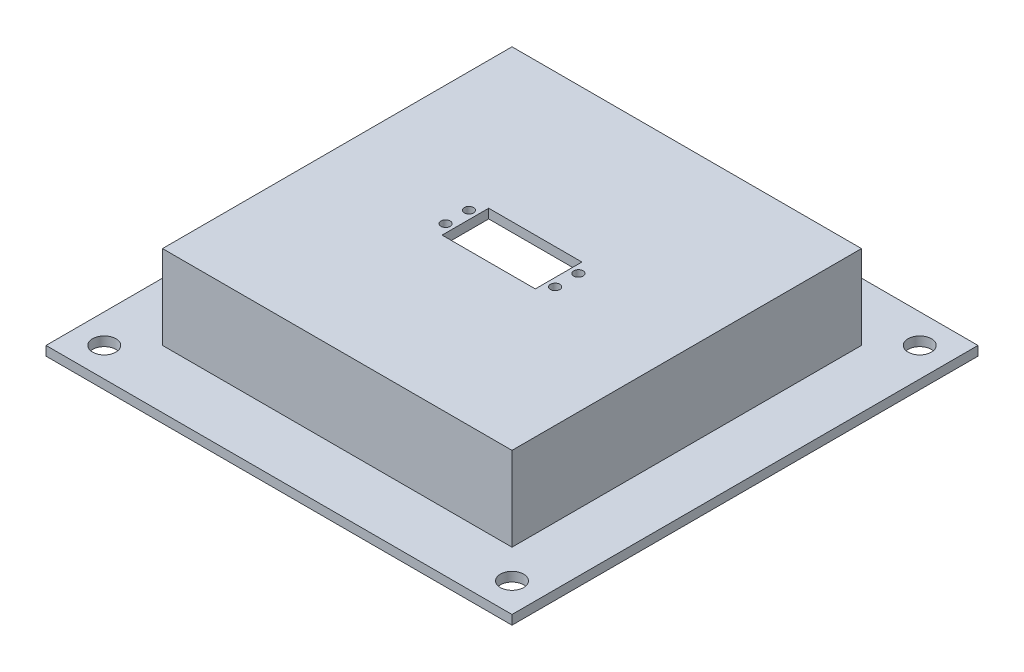
ISO-10303-21;
HEADER;
FILE_DESCRIPTION(('STEP AP214'),'2;1');
FILE_NAME('part.step','',(''),(''),'','','');
FILE_SCHEMA(('AUTOMOTIVE_DESIGN { 1 0 10303 214 1 1 1 1 }'));
ENDSEC;
DATA;
#1=APPLICATION_CONTEXT('core data for automotive mechanical design processes');
#2=APPLICATION_PROTOCOL_DEFINITION('international standard','automotive_design',2000,#1);
#3=PRODUCT_CONTEXT('',#1,'mechanical');
#4=PRODUCT('Part','Part','',(#3));
#5=PRODUCT_RELATED_PRODUCT_CATEGORY('part','',(#4));
#6=PRODUCT_DEFINITION_FORMATION('','',#4);
#7=PRODUCT_DEFINITION_CONTEXT('part definition',#1,'design');
#8=PRODUCT_DEFINITION('design','',#6,#7);
#9=PRODUCT_DEFINITION_SHAPE('','',#8);
#10=(LENGTH_UNIT() NAMED_UNIT(*) SI_UNIT(.MILLI.,.METRE.));
#11=(NAMED_UNIT(*) PLANE_ANGLE_UNIT() SI_UNIT($,.RADIAN.));
#12=(NAMED_UNIT(*) SI_UNIT($,.STERADIAN.) SOLID_ANGLE_UNIT());
#13=UNCERTAINTY_MEASURE_WITH_UNIT(LENGTH_MEASURE(1.E-05),#10,'distance_accuracy_value','');
#14=(GEOMETRIC_REPRESENTATION_CONTEXT(3) GLOBAL_UNCERTAINTY_ASSIGNED_CONTEXT((#13)) GLOBAL_UNIT_ASSIGNED_CONTEXT((#10,
#11,#12)) REPRESENTATION_CONTEXT('',''));
#15=CARTESIAN_POINT('',(0.,0.,0.));
#16=DIRECTION('',(0.,0.,1.));
#17=DIRECTION('',(1.,0.,0.));
#18=AXIS2_PLACEMENT_3D('',#15,#16,#17);
#19=CARTESIAN_POINT('',(0.,0.,0.));
#20=DIRECTION('',(0.,1.,0.));
#21=DIRECTION('',(0.,0.,1.));
#22=AXIS2_PLACEMENT_3D('',#19,#20,#21);
#23=PLANE('',#22);
#24=CARTESIAN_POINT('',(12.4999999999999,0.,12.5));
#25=DIRECTION('',(0.,1.,0.));
#26=DIRECTION('',(0.,0.,1.));
#27=AXIS2_PLACEMENT_3D('',#24,#25,#26);
#28=CIRCLE('',#27,5.00000000000001);
#29=CARTESIAN_POINT('',(12.4999999999999,0.,17.5));
#30=VERTEX_POINT('',#29);
#31=EDGE_CURVE('E186',#30,#30,#28,.F.);
#32=ORIENTED_EDGE('',*,*,#31,.F.);
#33=EDGE_LOOP('',(#32));
#34=FACE_BOUND('',#33,.T.);
#35=CARTESIAN_POINT('',(-162.5,0.,12.4999999999999));
#36=DIRECTION('',(0.,1.,0.));
#37=DIRECTION('',(0.,0.,1.));
#38=AXIS2_PLACEMENT_3D('',#35,#36,#37);
#39=CIRCLE('',#38,5.00000000000005);
#40=CARTESIAN_POINT('',(-162.5,0.,17.5));
#41=VERTEX_POINT('',#40);
#42=EDGE_CURVE('E187',#41,#41,#39,.F.);
#43=ORIENTED_EDGE('',*,*,#42,.F.);
#44=EDGE_LOOP('',(#43));
#45=FACE_BOUND('',#44,.T.);
#46=CARTESIAN_POINT('',(-162.5,0.,-162.5));
#47=DIRECTION('',(0.,1.,0.));
#48=DIRECTION('',(0.,0.,1.));
#49=AXIS2_PLACEMENT_3D('',#46,#47,#48);
#50=CIRCLE('',#49,5.00000000000003);
#51=CARTESIAN_POINT('',(-162.5,0.,-157.5));
#52=VERTEX_POINT('',#51);
#53=EDGE_CURVE('E194',#52,#52,#50,.F.);
#54=ORIENTED_EDGE('',*,*,#53,.F.);
#55=EDGE_LOOP('',(#54));
#56=FACE_BOUND('',#55,.T.);
#57=CARTESIAN_POINT('',(12.5,0.,-162.5));
#58=DIRECTION('',(0.,1.,0.));
#59=DIRECTION('',(0.,0.,1.));
#60=AXIS2_PLACEMENT_3D('',#57,#58,#59);
#61=CIRCLE('',#60,5.);
#62=CARTESIAN_POINT('',(12.5,0.,-157.5));
#63=VERTEX_POINT('',#62);
#64=EDGE_CURVE('E203',#63,#63,#61,.F.);
#65=ORIENTED_EDGE('',*,*,#64,.F.);
#66=EDGE_LOOP('',(#65));
#67=FACE_BOUND('',#66,.T.);
#68=DIRECTION('',(1.,0.,0.));
#69=VECTOR('',#68,1.);
#70=CARTESIAN_POINT('',(0.,0.,-4.));
#71=LINE('',#70,#69);
#72=CARTESIAN_POINT('',(-146.,0.,-3.99999999999998));
#73=VERTEX_POINT('',#72);
#74=CARTESIAN_POINT('',(-4.,0.,-4.));
#75=VERTEX_POINT('',#74);
#76=EDGE_CURVE('E260',#73,#75,#71,.T.);
#77=ORIENTED_EDGE('',*,*,#76,.T.);
#78=DIRECTION('',(0.,0.,-1.));
#79=VECTOR('',#78,1.);
#80=CARTESIAN_POINT('',(-4.,0.,0.));
#81=LINE('',#80,#79);
#82=CARTESIAN_POINT('',(-4.,0.,-146.));
#83=VERTEX_POINT('',#82);
#84=EDGE_CURVE('E245',#75,#83,#81,.T.);
#85=ORIENTED_EDGE('',*,*,#84,.T.);
#86=DIRECTION('',(-1.,0.,0.));
#87=VECTOR('',#86,1.);
#88=CARTESIAN_POINT('',(0.,0.,-146.));
#89=LINE('',#88,#87);
#90=CARTESIAN_POINT('',(-146.,0.,-146.));
#91=VERTEX_POINT('',#90);
#92=EDGE_CURVE('E274',#83,#91,#89,.T.);
#93=ORIENTED_EDGE('',*,*,#92,.T.);
#94=DIRECTION('',(0.,0.,1.));
#95=VECTOR('',#94,1.);
#96=CARTESIAN_POINT('',(-146.,0.,0.));
#97=LINE('',#96,#95);
#98=EDGE_CURVE('E277',#91,#73,#97,.T.);
#99=ORIENTED_EDGE('',*,*,#98,.T.);
#100=EDGE_LOOP('',(#77,#85,#93,#99));
#101=FACE_BOUND('',#100,.T.);
#102=DIRECTION('',(0.,0.,1.));
#103=VECTOR('',#102,1.);
#104=CARTESIAN_POINT('',(25.0000000000001,0.,-175.));
#105=LINE('',#104,#103);
#106=CARTESIAN_POINT('',(25.0000000000001,0.,-175.));
#107=VERTEX_POINT('',#106);
#108=CARTESIAN_POINT('',(25.0000000000001,0.,25.));
#109=VERTEX_POINT('',#108);
#110=EDGE_CURVE('E218',#107,#109,#105,.T.);
#111=ORIENTED_EDGE('',*,*,#110,.T.);
#112=DIRECTION('',(-1.,0.,0.));
#113=VECTOR('',#112,1.);
#114=CARTESIAN_POINT('',(25.0000000000001,0.,25.));
#115=LINE('',#114,#113);
#116=CARTESIAN_POINT('',(-175.,0.,25.));
#117=VERTEX_POINT('',#116);
#118=EDGE_CURVE('E235',#109,#117,#115,.T.);
#119=ORIENTED_EDGE('',*,*,#118,.T.);
#120=DIRECTION('',(0.,0.,-1.));
#121=VECTOR('',#120,1.);
#122=CARTESIAN_POINT('',(-175.,0.,-175.));
#123=LINE('',#122,#121);
#124=CARTESIAN_POINT('',(-175.,0.,-175.));
#125=VERTEX_POINT('',#124);
#126=EDGE_CURVE('E238',#117,#125,#123,.T.);
#127=ORIENTED_EDGE('',*,*,#126,.T.);
#128=DIRECTION('',(1.,0.,0.));
#129=VECTOR('',#128,1.);
#130=CARTESIAN_POINT('',(25.0000000000001,0.,-175.));
#131=LINE('',#130,#129);
#132=EDGE_CURVE('E223',#125,#107,#131,.T.);
#133=ORIENTED_EDGE('',*,*,#132,.T.);
#134=EDGE_LOOP('',(#111,#119,#127,#133));
#135=FACE_BOUND('',#134,.T.);
#136=ADVANCED_FACE('F33',(#34,#45,#56,#67,#101,#135),#23,.F.);
#137=CARTESIAN_POINT('',(-4.,40.,0.));
#138=DIRECTION('',(-1.,0.,0.));
#139=DIRECTION('',(0.,0.,1.));
#140=AXIS2_PLACEMENT_3D('',#137,#138,#139);
#141=PLANE('',#140);
#142=ORIENTED_EDGE('',*,*,#84,.F.);
#143=DIRECTION('',(0.,-1.,0.));
#144=VECTOR('',#143,1.);
#145=CARTESIAN_POINT('',(-4.,40.,-4.));
#146=LINE('',#145,#144);
#147=CARTESIAN_POINT('',(-4.,36.,-4.));
#148=VERTEX_POINT('',#147);
#149=EDGE_CURVE('E261',#148,#75,#146,.T.);
#150=ORIENTED_EDGE('',*,*,#149,.F.);
#151=DIRECTION('',(0.,0.,-1.));
#152=VECTOR('',#151,1.);
#153=CARTESIAN_POINT('',(-4.,36.,0.));
#154=LINE('',#153,#152);
#155=CARTESIAN_POINT('',(-4.,36.,-146.));
#156=VERTEX_POINT('',#155);
#157=EDGE_CURVE('E256',#148,#156,#154,.T.);
#158=ORIENTED_EDGE('',*,*,#157,.T.);
#159=DIRECTION('',(0.,-1.,0.));
#160=VECTOR('',#159,1.);
#161=CARTESIAN_POINT('',(-4.,40.,-146.));
#162=LINE('',#161,#160);
#163=EDGE_CURVE('E251',#156,#83,#162,.T.);
#164=ORIENTED_EDGE('',*,*,#163,.T.);
#165=EDGE_LOOP('',(#142,#150,#158,#164));
#166=FACE_BOUND('',#165,.T.);
#167=ADVANCED_FACE('F323',(#166),#141,.T.);
#168=CARTESIAN_POINT('',(0.,40.,-146.));
#169=DIRECTION('',(0.,0.,1.));
#170=DIRECTION('',(1.,0.,0.));
#171=AXIS2_PLACEMENT_3D('',#168,#169,#170);
#172=PLANE('',#171);
#173=ORIENTED_EDGE('',*,*,#92,.F.);
#174=ORIENTED_EDGE('',*,*,#163,.F.);
#175=DIRECTION('',(-1.,0.,0.));
#176=VECTOR('',#175,1.);
#177=CARTESIAN_POINT('',(0.,36.,-146.));
#178=LINE('',#177,#176);
#179=CARTESIAN_POINT('',(-146.,36.,-146.));
#180=VERTEX_POINT('',#179);
#181=EDGE_CURVE('E259',#156,#180,#178,.T.);
#182=ORIENTED_EDGE('',*,*,#181,.T.);
#183=DIRECTION('',(0.,-1.,0.));
#184=VECTOR('',#183,1.);
#185=CARTESIAN_POINT('',(-146.,40.,-146.));
#186=LINE('',#185,#184);
#187=EDGE_CURVE('E255',#180,#91,#186,.T.);
#188=ORIENTED_EDGE('',*,*,#187,.T.);
#189=EDGE_LOOP('',(#173,#174,#182,#188));
#190=FACE_BOUND('',#189,.T.);
#191=ADVANCED_FACE('F329',(#190),#172,.T.);
#192=CARTESIAN_POINT('',(-146.,40.,0.));
#193=DIRECTION('',(1.,0.,0.));
#194=DIRECTION('',(0.,0.,-1.));
#195=AXIS2_PLACEMENT_3D('',#192,#193,#194);
#196=PLANE('',#195);
#197=ORIENTED_EDGE('',*,*,#98,.F.);
#198=ORIENTED_EDGE('',*,*,#187,.F.);
#199=DIRECTION('',(0.,0.,1.));
#200=VECTOR('',#199,1.);
#201=CARTESIAN_POINT('',(-146.,36.,0.));
#202=LINE('',#201,#200);
#203=CARTESIAN_POINT('',(-146.,36.,-3.99999999999998));
#204=VERTEX_POINT('',#203);
#205=EDGE_CURVE('E268',#180,#204,#202,.T.);
#206=ORIENTED_EDGE('',*,*,#205,.T.);
#207=DIRECTION('',(0.,-1.,0.));
#208=VECTOR('',#207,1.);
#209=CARTESIAN_POINT('',(-146.,40.,-3.99999999999998));
#210=LINE('',#209,#208);
#211=EDGE_CURVE('E263',#204,#73,#210,.T.);
#212=ORIENTED_EDGE('',*,*,#211,.T.);
#213=EDGE_LOOP('',(#197,#198,#206,#212));
#214=FACE_BOUND('',#213,.T.);
#215=ADVANCED_FACE('F454',(#214),#196,.T.);
#216=CARTESIAN_POINT('',(0.,40.,-4.));
#217=DIRECTION('',(0.,0.,-1.));
#218=DIRECTION('',(-1.,0.,0.));
#219=AXIS2_PLACEMENT_3D('',#216,#217,#218);
#220=PLANE('',#219);
#221=ORIENTED_EDGE('',*,*,#76,.F.);
#222=ORIENTED_EDGE('',*,*,#211,.F.);
#223=DIRECTION('',(1.,0.,0.));
#224=VECTOR('',#223,1.);
#225=CARTESIAN_POINT('',(0.,36.,-4.));
#226=LINE('',#225,#224);
#227=EDGE_CURVE('E264',#204,#148,#226,.T.);
#228=ORIENTED_EDGE('',*,*,#227,.T.);
#229=ORIENTED_EDGE('',*,*,#149,.T.);
#230=EDGE_LOOP('',(#221,#222,#228,#229));
#231=FACE_BOUND('',#230,.T.);
#232=ADVANCED_FACE('F396',(#231),#220,.T.);
#233=CARTESIAN_POINT('',(0.,36.,0.));
#234=DIRECTION('',(0.,1.,0.));
#235=DIRECTION('',(0.,0.,1.));
#236=AXIS2_PLACEMENT_3D('',#233,#234,#235);
#237=PLANE('',#236);
#238=CARTESIAN_POINT('',(-51.5,36.,-70.));
#239=DIRECTION('',(0.,1.,0.));
#240=DIRECTION('',(0.,0.,1.));
#241=AXIS2_PLACEMENT_3D('',#238,#239,#240);
#242=CIRCLE('',#241,2.);
#243=CARTESIAN_POINT('',(-51.5,36.,-68.));
#244=VERTEX_POINT('',#243);
#245=EDGE_CURVE('E369',#244,#244,#242,.F.);
#246=ORIENTED_EDGE('',*,*,#245,.F.);
#247=EDGE_LOOP('',(#246));
#248=FACE_BOUND('',#247,.T.);
#249=CARTESIAN_POINT('',(-51.5,36.,-80.));
#250=DIRECTION('',(0.,1.,0.));
#251=DIRECTION('',(0.,0.,1.));
#252=AXIS2_PLACEMENT_3D('',#249,#250,#251);
#253=CIRCLE('',#252,2.);
#254=CARTESIAN_POINT('',(-51.5,36.,-78.));
#255=VERTEX_POINT('',#254);
#256=EDGE_CURVE('E381',#255,#255,#253,.F.);
#257=ORIENTED_EDGE('',*,*,#256,.F.);
#258=EDGE_LOOP('',(#257));
#259=FACE_BOUND('',#258,.T.);
#260=CARTESIAN_POINT('',(-98.5,36.,-80.));
#261=DIRECTION('',(0.,1.,0.));
#262=DIRECTION('',(0.,0.,1.));
#263=AXIS2_PLACEMENT_3D('',#260,#261,#262);
#264=CIRCLE('',#263,2.);
#265=CARTESIAN_POINT('',(-98.5,36.,-78.));
#266=VERTEX_POINT('',#265);
#267=EDGE_CURVE('E377',#266,#266,#264,.F.);
#268=ORIENTED_EDGE('',*,*,#267,.F.);
#269=EDGE_LOOP('',(#268));
#270=FACE_BOUND('',#269,.T.);
#271=CARTESIAN_POINT('',(-98.5,36.,-70.));
#272=DIRECTION('',(0.,1.,0.));
#273=DIRECTION('',(0.,0.,1.));
#274=AXIS2_PLACEMENT_3D('',#271,#272,#273);
#275=CIRCLE('',#274,2.);
#276=CARTESIAN_POINT('',(-98.5,36.,-68.));
#277=VERTEX_POINT('',#276);
#278=EDGE_CURVE('E373',#277,#277,#275,.F.);
#279=ORIENTED_EDGE('',*,*,#278,.F.);
#280=EDGE_LOOP('',(#279));
#281=FACE_BOUND('',#280,.T.);
#282=DIRECTION('',(1.,0.,0.));
#283=VECTOR('',#282,1.);
#284=CARTESIAN_POINT('',(-95.,36.,-85.));
#285=LINE('',#284,#283);
#286=CARTESIAN_POINT('',(-95.,36.,-85.));
#287=VERTEX_POINT('',#286);
#288=CARTESIAN_POINT('',(-55.,36.,-85.));
#289=VERTEX_POINT('',#288);
#290=EDGE_CURVE('E166',#287,#289,#285,.T.);
#291=ORIENTED_EDGE('',*,*,#290,.F.);
#292=DIRECTION('',(0.,0.,-1.));
#293=VECTOR('',#292,1.);
#294=CARTESIAN_POINT('',(-95.,36.,-85.));
#295=LINE('',#294,#293);
#296=CARTESIAN_POINT('',(-95.,36.,-65.));
#297=VERTEX_POINT('',#296);
#298=EDGE_CURVE('E148',#297,#287,#295,.T.);
#299=ORIENTED_EDGE('',*,*,#298,.F.);
#300=DIRECTION('',(-1.,0.,0.));
#301=VECTOR('',#300,1.);
#302=CARTESIAN_POINT('',(-95.,36.,-65.));
#303=LINE('',#302,#301);
#304=CARTESIAN_POINT('',(-55.,36.,-65.));
#305=VERTEX_POINT('',#304);
#306=EDGE_CURVE('E157',#305,#297,#303,.T.);
#307=ORIENTED_EDGE('',*,*,#306,.F.);
#308=DIRECTION('',(0.,0.,1.));
#309=VECTOR('',#308,1.);
#310=CARTESIAN_POINT('',(-55.,36.,-85.));
#311=LINE('',#310,#309);
#312=EDGE_CURVE('E48',#289,#305,#311,.T.);
#313=ORIENTED_EDGE('',*,*,#312,.F.);
#314=EDGE_LOOP('',(#291,#299,#307,#313));
#315=FACE_BOUND('',#314,.T.);
#316=ORIENTED_EDGE('',*,*,#157,.F.);
#317=ORIENTED_EDGE('',*,*,#227,.F.);
#318=ORIENTED_EDGE('',*,*,#205,.F.);
#319=ORIENTED_EDGE('',*,*,#181,.F.);
#320=EDGE_LOOP('',(#316,#317,#318,#319));
#321=FACE_BOUND('',#320,.T.);
#322=ADVANCED_FACE('F163',(#248,#259,#270,#281,#315,#321),#237,.F.);
#323=CARTESIAN_POINT('',(25.0000000000001,4.,-175.));
#324=DIRECTION('',(1.,0.,0.));
#325=DIRECTION('',(0.,0.,-1.));
#326=AXIS2_PLACEMENT_3D('',#323,#324,#325);
#327=PLANE('',#326);
#328=ORIENTED_EDGE('',*,*,#110,.F.);
#329=DIRECTION('',(0.,-1.,0.));
#330=VECTOR('',#329,1.);
#331=CARTESIAN_POINT('',(25.0000000000001,4.,-175.));
#332=LINE('',#331,#330);
#333=CARTESIAN_POINT('',(25.0000000000001,4.,-175.));
#334=VERTEX_POINT('',#333);
#335=EDGE_CURVE('E243',#334,#107,#332,.T.);
#336=ORIENTED_EDGE('',*,*,#335,.F.);
#337=DIRECTION('',(0.,0.,1.));
#338=VECTOR('',#337,1.);
#339=CARTESIAN_POINT('',(25.0000000000001,4.,-175.));
#340=LINE('',#339,#338);
#341=CARTESIAN_POINT('',(25.0000000000001,4.,25.));
#342=VERTEX_POINT('',#341);
#343=EDGE_CURVE('E219',#334,#342,#340,.T.);
#344=ORIENTED_EDGE('',*,*,#343,.T.);
#345=DIRECTION('',(0.,-1.,0.));
#346=VECTOR('',#345,1.);
#347=CARTESIAN_POINT('',(25.0000000000001,4.,25.));
#348=LINE('',#347,#346);
#349=EDGE_CURVE('E232',#342,#109,#348,.T.);
#350=ORIENTED_EDGE('',*,*,#349,.T.);
#351=EDGE_LOOP('',(#328,#336,#344,#350));
#352=FACE_BOUND('',#351,.T.);
#353=ADVANCED_FACE('F395',(#352),#327,.T.);
#354=CARTESIAN_POINT('',(25.0000000000001,4.,-175.));
#355=DIRECTION('',(0.,0.,-1.));
#356=DIRECTION('',(-1.,0.,0.));
#357=AXIS2_PLACEMENT_3D('',#354,#355,#356);
#358=PLANE('',#357);
#359=ORIENTED_EDGE('',*,*,#132,.F.);
#360=DIRECTION('',(0.,-1.,0.));
#361=VECTOR('',#360,1.);
#362=CARTESIAN_POINT('',(-175.,4.,-175.));
#363=LINE('',#362,#361);
#364=CARTESIAN_POINT('',(-175.,4.,-175.));
#365=VERTEX_POINT('',#364);
#366=EDGE_CURVE('E246',#365,#125,#363,.T.);
#367=ORIENTED_EDGE('',*,*,#366,.F.);
#368=DIRECTION('',(1.,0.,0.));
#369=VECTOR('',#368,1.);
#370=CARTESIAN_POINT('',(25.0000000000001,4.,-175.));
#371=LINE('',#370,#369);
#372=EDGE_CURVE('E229',#365,#334,#371,.T.);
#373=ORIENTED_EDGE('',*,*,#372,.T.);
#374=ORIENTED_EDGE('',*,*,#335,.T.);
#375=EDGE_LOOP('',(#359,#367,#373,#374));
#376=FACE_BOUND('',#375,.T.);
#377=ADVANCED_FACE('F438',(#376),#358,.T.);
#378=CARTESIAN_POINT('',(-175.,4.,-175.));
#379=DIRECTION('',(-1.,0.,0.));
#380=DIRECTION('',(0.,0.,1.));
#381=AXIS2_PLACEMENT_3D('',#378,#379,#380);
#382=PLANE('',#381);
#383=ORIENTED_EDGE('',*,*,#126,.F.);
#384=DIRECTION('',(0.,-1.,0.));
#385=VECTOR('',#384,1.);
#386=CARTESIAN_POINT('',(-175.,4.,25.));
#387=LINE('',#386,#385);
#388=CARTESIAN_POINT('',(-175.,4.,25.));
#389=VERTEX_POINT('',#388);
#390=EDGE_CURVE('E248',#389,#117,#387,.T.);
#391=ORIENTED_EDGE('',*,*,#390,.F.);
#392=DIRECTION('',(0.,0.,-1.));
#393=VECTOR('',#392,1.);
#394=CARTESIAN_POINT('',(-175.,4.,-175.));
#395=LINE('',#394,#393);
#396=EDGE_CURVE('E226',#389,#365,#395,.T.);
#397=ORIENTED_EDGE('',*,*,#396,.T.);
#398=ORIENTED_EDGE('',*,*,#366,.T.);
#399=EDGE_LOOP('',(#383,#391,#397,#398));
#400=FACE_BOUND('',#399,.T.);
#401=ADVANCED_FACE('F441',(#400),#382,.T.);
#402=CARTESIAN_POINT('',(25.0000000000001,4.,25.));
#403=DIRECTION('',(0.,0.,1.));
#404=DIRECTION('',(1.,0.,0.));
#405=AXIS2_PLACEMENT_3D('',#402,#403,#404);
#406=PLANE('',#405);
#407=ORIENTED_EDGE('',*,*,#118,.F.);
#408=ORIENTED_EDGE('',*,*,#349,.F.);
#409=DIRECTION('',(-1.,0.,0.));
#410=VECTOR('',#409,1.);
#411=CARTESIAN_POINT('',(25.0000000000001,4.,25.));
#412=LINE('',#411,#410);
#413=EDGE_CURVE('E222',#342,#389,#412,.T.);
#414=ORIENTED_EDGE('',*,*,#413,.T.);
#415=ORIENTED_EDGE('',*,*,#390,.T.);
#416=EDGE_LOOP('',(#407,#408,#414,#415));
#417=FACE_BOUND('',#416,.T.);
#418=ADVANCED_FACE('F345',(#417),#406,.T.);
#419=CARTESIAN_POINT('',(0.,4.,0.));
#420=DIRECTION('',(0.,-1.,0.));
#421=DIRECTION('',(0.,0.,-1.));
#422=AXIS2_PLACEMENT_3D('',#419,#420,#421);
#423=PLANE('',#422);
#424=CARTESIAN_POINT('',(12.4999999999999,4.,12.5));
#425=DIRECTION('',(0.,1.,0.));
#426=DIRECTION('',(0.,0.,-1.));
#427=AXIS2_PLACEMENT_3D('',#424,#425,#426);
#428=CIRCLE('',#427,5.00000000000001);
#429=CARTESIAN_POINT('',(12.4999999999999,4.,7.5));
#430=VERTEX_POINT('',#429);
#431=EDGE_CURVE('E183',#430,#430,#428,.T.);
#432=ORIENTED_EDGE('',*,*,#431,.F.);
#433=EDGE_LOOP('',(#432));
#434=FACE_BOUND('',#433,.T.);
#435=CARTESIAN_POINT('',(-162.5,4.,12.4999999999999));
#436=DIRECTION('',(0.,1.,0.));
#437=DIRECTION('',(0.,0.,1.));
#438=AXIS2_PLACEMENT_3D('',#435,#436,#437);
#439=CIRCLE('',#438,5.00000000000005);
#440=CARTESIAN_POINT('',(-162.5,4.,17.5));
#441=VERTEX_POINT('',#440);
#442=EDGE_CURVE('E191',#441,#441,#439,.T.);
#443=ORIENTED_EDGE('',*,*,#442,.F.);
#444=EDGE_LOOP('',(#443));
#445=FACE_BOUND('',#444,.T.);
#446=CARTESIAN_POINT('',(-162.5,4.,-162.5));
#447=DIRECTION('',(0.,1.,0.));
#448=DIRECTION('',(0.,0.,-1.));
#449=AXIS2_PLACEMENT_3D('',#446,#447,#448);
#450=CIRCLE('',#449,5.00000000000003);
#451=CARTESIAN_POINT('',(-162.5,4.,-167.5));
#452=VERTEX_POINT('',#451);
#453=EDGE_CURVE('E160',#452,#452,#450,.T.);
#454=ORIENTED_EDGE('',*,*,#453,.F.);
#455=EDGE_LOOP('',(#454));
#456=FACE_BOUND('',#455,.T.);
#457=CARTESIAN_POINT('',(12.5,4.,-162.5));
#458=DIRECTION('',(0.,1.,0.));
#459=DIRECTION('',(0.,0.,1.));
#460=AXIS2_PLACEMENT_3D('',#457,#458,#459);
#461=CIRCLE('',#460,5.);
#462=CARTESIAN_POINT('',(12.5,4.,-157.5));
#463=VERTEX_POINT('',#462);
#464=EDGE_CURVE('E190',#463,#463,#461,.T.);
#465=ORIENTED_EDGE('',*,*,#464,.F.);
#466=EDGE_LOOP('',(#465));
#467=FACE_BOUND('',#466,.T.);
#468=DIRECTION('',(1.,0.,0.));
#469=VECTOR('',#468,1.);
#470=CARTESIAN_POINT('',(0.,4.,-150.));
#471=LINE('',#470,#469);
#472=CARTESIAN_POINT('',(-150.,4.00000000000001,-150.));
#473=VERTEX_POINT('',#472);
#474=CARTESIAN_POINT('',(0.,4.00000000000001,-150.));
#475=VERTEX_POINT('',#474);
#476=EDGE_CURVE('E215',#473,#475,#471,.T.);
#477=ORIENTED_EDGE('',*,*,#476,.T.);
#478=DIRECTION('',(0.,0.,1.));
#479=VECTOR('',#478,1.);
#480=CARTESIAN_POINT('',(0.,4.,-150.));
#481=LINE('',#480,#479);
#482=CARTESIAN_POINT('',(0.,4.00000000000001,0.));
#483=VERTEX_POINT('',#482);
#484=EDGE_CURVE('E206',#475,#483,#481,.T.);
#485=ORIENTED_EDGE('',*,*,#484,.T.);
#486=DIRECTION('',(-1.,0.,0.));
#487=VECTOR('',#486,1.);
#488=CARTESIAN_POINT('',(0.,4.,0.));
#489=LINE('',#488,#487);
#490=CARTESIAN_POINT('',(-150.,4.,0.));
#491=VERTEX_POINT('',#490);
#492=EDGE_CURVE('E209',#483,#491,#489,.T.);
#493=ORIENTED_EDGE('',*,*,#492,.T.);
#494=DIRECTION('',(0.,0.,-1.));
#495=VECTOR('',#494,1.);
#496=CARTESIAN_POINT('',(-150.,4.,-150.));
#497=LINE('',#496,#495);
#498=EDGE_CURVE('E212',#491,#473,#497,.T.);
#499=ORIENTED_EDGE('',*,*,#498,.T.);
#500=EDGE_LOOP('',(#477,#485,#493,#499));
#501=FACE_BOUND('',#500,.T.);
#502=ORIENTED_EDGE('',*,*,#343,.F.);
#503=ORIENTED_EDGE('',*,*,#372,.F.);
#504=ORIENTED_EDGE('',*,*,#396,.F.);
#505=ORIENTED_EDGE('',*,*,#413,.F.);
#506=EDGE_LOOP('',(#502,#503,#504,#505));
#507=FACE_BOUND('',#506,.T.);
#508=ADVANCED_FACE('F303',(#434,#445,#456,#467,#501,#507),#423,.F.);
#509=CARTESIAN_POINT('',(0.,40.,0.));
#510=DIRECTION('',(0.,1.,0.));
#511=DIRECTION('',(0.,0.,1.));
#512=AXIS2_PLACEMENT_3D('',#509,#510,#511);
#513=PLANE('',#512);
#514=CARTESIAN_POINT('',(-51.5,40.,-70.));
#515=DIRECTION('',(0.,1.,0.));
#516=DIRECTION('',(0.,0.,1.));
#517=AXIS2_PLACEMENT_3D('',#514,#515,#516);
#518=CIRCLE('',#517,2.);
#519=CARTESIAN_POINT('',(-51.5,40.,-68.));
#520=VERTEX_POINT('',#519);
#521=EDGE_CURVE('E351',#520,#520,#518,.T.);
#522=ORIENTED_EDGE('',*,*,#521,.F.);
#523=EDGE_LOOP('',(#522));
#524=FACE_BOUND('',#523,.T.);
#525=CARTESIAN_POINT('',(-51.5,40.,-80.));
#526=DIRECTION('',(0.,1.,0.));
#527=DIRECTION('',(0.,0.,-1.));
#528=AXIS2_PLACEMENT_3D('',#525,#526,#527);
#529=CIRCLE('',#528,2.);
#530=CARTESIAN_POINT('',(-51.5,40.,-82.));
#531=VERTEX_POINT('',#530);
#532=EDGE_CURVE('E355',#531,#531,#529,.T.);
#533=ORIENTED_EDGE('',*,*,#532,.F.);
#534=EDGE_LOOP('',(#533));
#535=FACE_BOUND('',#534,.T.);
#536=CARTESIAN_POINT('',(-98.5,40.,-80.));
#537=DIRECTION('',(0.,1.,0.));
#538=DIRECTION('',(0.,0.,1.));
#539=AXIS2_PLACEMENT_3D('',#536,#537,#538);
#540=CIRCLE('',#539,2.);
#541=CARTESIAN_POINT('',(-98.5,40.,-78.));
#542=VERTEX_POINT('',#541);
#543=EDGE_CURVE('E359',#542,#542,#540,.T.);
#544=ORIENTED_EDGE('',*,*,#543,.F.);
#545=EDGE_LOOP('',(#544));
#546=FACE_BOUND('',#545,.T.);
#547=CARTESIAN_POINT('',(-98.5,40.,-70.));
#548=DIRECTION('',(0.,1.,0.));
#549=DIRECTION('',(0.,0.,-1.));
#550=AXIS2_PLACEMENT_3D('',#547,#548,#549);
#551=CIRCLE('',#550,2.);
#552=CARTESIAN_POINT('',(-98.5,40.,-72.));
#553=VERTEX_POINT('',#552);
#554=EDGE_CURVE('E363',#553,#553,#551,.T.);
#555=ORIENTED_EDGE('',*,*,#554,.F.);
#556=EDGE_LOOP('',(#555));
#557=FACE_BOUND('',#556,.T.);
#558=DIRECTION('',(0.,0.,1.));
#559=VECTOR('',#558,1.);
#560=CARTESIAN_POINT('',(-95.,40.,-85.));
#561=LINE('',#560,#559);
#562=CARTESIAN_POINT('',(-95.,40.,-85.));
#563=VERTEX_POINT('',#562);
#564=CARTESIAN_POINT('',(-95.,40.,-65.));
#565=VERTEX_POINT('',#564);
#566=EDGE_CURVE('E56',#563,#565,#561,.T.);
#567=ORIENTED_EDGE('',*,*,#566,.F.);
#568=DIRECTION('',(-1.,0.,0.));
#569=VECTOR('',#568,1.);
#570=CARTESIAN_POINT('',(-95.,40.,-85.));
#571=LINE('',#570,#569);
#572=CARTESIAN_POINT('',(-55.,40.,-85.));
#573=VERTEX_POINT('',#572);
#574=EDGE_CURVE('E154',#573,#563,#571,.T.);
#575=ORIENTED_EDGE('',*,*,#574,.F.);
#576=DIRECTION('',(0.,0.,-1.));
#577=VECTOR('',#576,1.);
#578=CARTESIAN_POINT('',(-55.,40.,-85.));
#579=LINE('',#578,#577);
#580=CARTESIAN_POINT('',(-55.,40.,-65.));
#581=VERTEX_POINT('',#580);
#582=EDGE_CURVE('E174',#581,#573,#579,.T.);
#583=ORIENTED_EDGE('',*,*,#582,.F.);
#584=DIRECTION('',(1.,0.,0.));
#585=VECTOR('',#584,1.);
#586=CARTESIAN_POINT('',(-95.,40.,-65.));
#587=LINE('',#586,#585);
#588=EDGE_CURVE('E168',#565,#581,#587,.T.);
#589=ORIENTED_EDGE('',*,*,#588,.F.);
#590=EDGE_LOOP('',(#567,#575,#583,#589));
#591=FACE_BOUND('',#590,.T.);
#592=DIRECTION('',(0.,0.,-1.));
#593=VECTOR('',#592,1.);
#594=CARTESIAN_POINT('',(0.,40.,0.));
#595=LINE('',#594,#593);
#596=CARTESIAN_POINT('',(0.,40.,0.));
#597=VERTEX_POINT('',#596);
#598=CARTESIAN_POINT('',(0.,40.,-150.));
#599=VERTEX_POINT('',#598);
#600=EDGE_CURVE('E254',#597,#599,#595,.T.);
#601=ORIENTED_EDGE('',*,*,#600,.T.);
#602=DIRECTION('',(-1.,0.,0.));
#603=VECTOR('',#602,1.);
#604=CARTESIAN_POINT('',(0.,40.,-150.));
#605=LINE('',#604,#603);
#606=CARTESIAN_POINT('',(-150.,40.,-150.));
#607=VERTEX_POINT('',#606);
#608=EDGE_CURVE('E284',#599,#607,#605,.T.);
#609=ORIENTED_EDGE('',*,*,#608,.T.);
#610=DIRECTION('',(0.,0.,1.));
#611=VECTOR('',#610,1.);
#612=CARTESIAN_POINT('',(-150.,40.,0.));
#613=LINE('',#612,#611);
#614=CARTESIAN_POINT('',(-150.,40.,0.));
#615=VERTEX_POINT('',#614);
#616=EDGE_CURVE('E286',#607,#615,#613,.T.);
#617=ORIENTED_EDGE('',*,*,#616,.T.);
#618=DIRECTION('',(1.,0.,0.));
#619=VECTOR('',#618,1.);
#620=CARTESIAN_POINT('',(0.,40.,0.));
#621=LINE('',#620,#619);
#622=EDGE_CURVE('E288',#615,#597,#621,.T.);
#623=ORIENTED_EDGE('',*,*,#622,.T.);
#624=EDGE_LOOP('',(#601,#609,#617,#623));
#625=FACE_BOUND('',#624,.T.);
#626=ADVANCED_FACE('F313',(#524,#535,#546,#557,#591,#625),#513,.T.);
#627=CARTESIAN_POINT('',(0.,40.,0.));
#628=DIRECTION('',(0.,0.,-1.));
#629=DIRECTION('',(-1.,0.,0.));
#630=AXIS2_PLACEMENT_3D('',#627,#628,#629);
#631=PLANE('',#630);
#632=ORIENTED_EDGE('',*,*,#492,.F.);
#633=DIRECTION('',(0.,-1.,0.));
#634=VECTOR('',#633,1.);
#635=CARTESIAN_POINT('',(0.,40.,0.));
#636=LINE('',#635,#634);
#637=EDGE_CURVE('E290',#597,#483,#636,.T.);
#638=ORIENTED_EDGE('',*,*,#637,.F.);
#639=ORIENTED_EDGE('',*,*,#622,.F.);
#640=DIRECTION('',(0.,-1.,0.));
#641=VECTOR('',#640,1.);
#642=CARTESIAN_POINT('',(-150.,40.,0.));
#643=LINE('',#642,#641);
#644=EDGE_CURVE('E293',#615,#491,#643,.T.);
#645=ORIENTED_EDGE('',*,*,#644,.T.);
#646=EDGE_LOOP('',(#632,#638,#639,#645));
#647=FACE_BOUND('',#646,.T.);
#648=ADVANCED_FACE('F307',(#647),#631,.F.);
#649=CARTESIAN_POINT('',(-150.,40.,0.));
#650=DIRECTION('',(1.,0.,0.));
#651=DIRECTION('',(0.,0.,-1.));
#652=AXIS2_PLACEMENT_3D('',#649,#650,#651);
#653=PLANE('',#652);
#654=ORIENTED_EDGE('',*,*,#498,.F.);
#655=ORIENTED_EDGE('',*,*,#644,.F.);
#656=ORIENTED_EDGE('',*,*,#616,.F.);
#657=DIRECTION('',(0.,-1.,0.));
#658=VECTOR('',#657,1.);
#659=CARTESIAN_POINT('',(-150.,40.,-150.));
#660=LINE('',#659,#658);
#661=EDGE_CURVE('E41',#607,#473,#660,.T.);
#662=ORIENTED_EDGE('',*,*,#661,.T.);
#663=EDGE_LOOP('',(#654,#655,#656,#662));
#664=FACE_BOUND('',#663,.T.);
#665=ADVANCED_FACE('F299',(#664),#653,.F.);
#666=CARTESIAN_POINT('',(0.,40.,-150.));
#667=DIRECTION('',(0.,0.,1.));
#668=DIRECTION('',(1.,0.,0.));
#669=AXIS2_PLACEMENT_3D('',#666,#667,#668);
#670=PLANE('',#669);
#671=ORIENTED_EDGE('',*,*,#476,.F.);
#672=ORIENTED_EDGE('',*,*,#661,.F.);
#673=ORIENTED_EDGE('',*,*,#608,.F.);
#674=DIRECTION('',(0.,-1.,0.));
#675=VECTOR('',#674,1.);
#676=CARTESIAN_POINT('',(0.,40.,-150.));
#677=LINE('',#676,#675);
#678=EDGE_CURVE('E11',#599,#475,#677,.T.);
#679=ORIENTED_EDGE('',*,*,#678,.T.);
#680=EDGE_LOOP('',(#671,#672,#673,#679));
#681=FACE_BOUND('',#680,.T.);
#682=ADVANCED_FACE('F314',(#681),#670,.F.);
#683=CARTESIAN_POINT('',(0.,40.,0.));
#684=DIRECTION('',(-1.,0.,0.));
#685=DIRECTION('',(0.,0.,1.));
#686=AXIS2_PLACEMENT_3D('',#683,#684,#685);
#687=PLANE('',#686);
#688=ORIENTED_EDGE('',*,*,#484,.F.);
#689=ORIENTED_EDGE('',*,*,#678,.F.);
#690=ORIENTED_EDGE('',*,*,#600,.F.);
#691=ORIENTED_EDGE('',*,*,#637,.T.);
#692=EDGE_LOOP('',(#688,#689,#690,#691));
#693=FACE_BOUND('',#692,.T.);
#694=ADVANCED_FACE('F35',(#693),#687,.F.);
#695=CARTESIAN_POINT('',(12.5,-0.00100000000000013,-162.5));
#696=DIRECTION('',(0.,1.,0.));
#697=DIRECTION('',(0.,0.,1.));
#698=AXIS2_PLACEMENT_3D('',#695,#696,#697);
#699=CYLINDRICAL_SURFACE('',#698,5.);
#700=ORIENTED_EDGE('',*,*,#464,.T.);
#701=EDGE_LOOP('',(#700));
#702=FACE_BOUND('',#701,.T.);
#703=ORIENTED_EDGE('',*,*,#64,.T.);
#704=EDGE_LOOP('',(#703));
#705=FACE_BOUND('',#704,.T.);
#706=ADVANCED_FACE('F320',(#702,#705),#699,.F.);
#707=CARTESIAN_POINT('',(-162.5,-0.00100000000000013,-162.5));
#708=DIRECTION('',(0.,1.,0.));
#709=DIRECTION('',(0.,0.,1.));
#710=AXIS2_PLACEMENT_3D('',#707,#708,#709);
#711=CYLINDRICAL_SURFACE('',#710,5.00000000000003);
#712=ORIENTED_EDGE('',*,*,#453,.T.);
#713=EDGE_LOOP('',(#712));
#714=FACE_BOUND('',#713,.T.);
#715=ORIENTED_EDGE('',*,*,#53,.T.);
#716=EDGE_LOOP('',(#715));
#717=FACE_BOUND('',#716,.T.);
#718=ADVANCED_FACE('F430',(#714,#717),#711,.F.);
#719=CARTESIAN_POINT('',(-162.5,-0.00100000000000013,12.4999999999999));
#720=DIRECTION('',(0.,1.,0.));
#721=DIRECTION('',(0.,0.,1.));
#722=AXIS2_PLACEMENT_3D('',#719,#720,#721);
#723=CYLINDRICAL_SURFACE('',#722,5.00000000000005);
#724=ORIENTED_EDGE('',*,*,#442,.T.);
#725=EDGE_LOOP('',(#724));
#726=FACE_BOUND('',#725,.T.);
#727=ORIENTED_EDGE('',*,*,#42,.T.);
#728=EDGE_LOOP('',(#727));
#729=FACE_BOUND('',#728,.T.);
#730=ADVANCED_FACE('F426',(#726,#729),#723,.F.);
#731=CARTESIAN_POINT('',(12.4999999999999,-0.00100000000000013,12.5));
#732=DIRECTION('',(0.,1.,0.));
#733=DIRECTION('',(0.,0.,1.));
#734=AXIS2_PLACEMENT_3D('',#731,#732,#733);
#735=CYLINDRICAL_SURFACE('',#734,5.00000000000001);
#736=ORIENTED_EDGE('',*,*,#431,.T.);
#737=EDGE_LOOP('',(#736));
#738=FACE_BOUND('',#737,.T.);
#739=ORIENTED_EDGE('',*,*,#31,.T.);
#740=EDGE_LOOP('',(#739));
#741=FACE_BOUND('',#740,.T.);
#742=ADVANCED_FACE('F423',(#738,#741),#735,.F.);
#743=CARTESIAN_POINT('',(-95.,-0.001000000000001,-85.));
#744=DIRECTION('',(-1.,0.,0.));
#745=DIRECTION('',(0.,0.,1.));
#746=AXIS2_PLACEMENT_3D('',#743,#744,#745);
#747=PLANE('',#746);
#748=ORIENTED_EDGE('',*,*,#298,.T.);
#749=DIRECTION('',(0.,1.,0.));
#750=VECTOR('',#749,1.);
#751=CARTESIAN_POINT('',(-95.,-0.001000000000001,-85.));
#752=LINE('',#751,#750);
#753=EDGE_CURVE('E161',#287,#563,#752,.T.);
#754=ORIENTED_EDGE('',*,*,#753,.T.);
#755=ORIENTED_EDGE('',*,*,#566,.T.);
#756=DIRECTION('',(0.,1.,0.));
#757=VECTOR('',#756,1.);
#758=CARTESIAN_POINT('',(-95.,-0.001000000000001,-65.));
#759=LINE('',#758,#757);
#760=EDGE_CURVE('E144',#297,#565,#759,.T.);
#761=ORIENTED_EDGE('',*,*,#760,.F.);
#762=EDGE_LOOP('',(#748,#754,#755,#761));
#763=FACE_BOUND('',#762,.T.);
#764=ADVANCED_FACE('F146',(#763),#747,.F.);
#765=CARTESIAN_POINT('',(-95.,-0.001000000000001,-85.));
#766=DIRECTION('',(0.,0.,-1.));
#767=DIRECTION('',(-1.,0.,0.));
#768=AXIS2_PLACEMENT_3D('',#765,#766,#767);
#769=PLANE('',#768);
#770=ORIENTED_EDGE('',*,*,#290,.T.);
#771=DIRECTION('',(0.,1.,0.));
#772=VECTOR('',#771,1.);
#773=CARTESIAN_POINT('',(-55.,-0.001000000000001,-85.));
#774=LINE('',#773,#772);
#775=EDGE_CURVE('E180',#289,#573,#774,.T.);
#776=ORIENTED_EDGE('',*,*,#775,.T.);
#777=ORIENTED_EDGE('',*,*,#574,.T.);
#778=ORIENTED_EDGE('',*,*,#753,.F.);
#779=EDGE_LOOP('',(#770,#776,#777,#778));
#780=FACE_BOUND('',#779,.T.);
#781=ADVANCED_FACE('F368',(#780),#769,.F.);
#782=CARTESIAN_POINT('',(-55.,-0.001000000000001,-85.));
#783=DIRECTION('',(1.,0.,0.));
#784=DIRECTION('',(0.,0.,-1.));
#785=AXIS2_PLACEMENT_3D('',#782,#783,#784);
#786=PLANE('',#785);
#787=ORIENTED_EDGE('',*,*,#312,.T.);
#788=DIRECTION('',(0.,1.,0.));
#789=VECTOR('',#788,1.);
#790=CARTESIAN_POINT('',(-55.,-0.001000000000001,-65.));
#791=LINE('',#790,#789);
#792=EDGE_CURVE('E153',#305,#581,#791,.T.);
#793=ORIENTED_EDGE('',*,*,#792,.T.);
#794=ORIENTED_EDGE('',*,*,#582,.T.);
#795=ORIENTED_EDGE('',*,*,#775,.F.);
#796=EDGE_LOOP('',(#787,#793,#794,#795));
#797=FACE_BOUND('',#796,.T.);
#798=ADVANCED_FACE('F366',(#797),#786,.F.);
#799=CARTESIAN_POINT('',(-95.,-0.001000000000001,-65.));
#800=DIRECTION('',(0.,0.,1.));
#801=DIRECTION('',(1.,0.,0.));
#802=AXIS2_PLACEMENT_3D('',#799,#800,#801);
#803=PLANE('',#802);
#804=ORIENTED_EDGE('',*,*,#306,.T.);
#805=ORIENTED_EDGE('',*,*,#760,.T.);
#806=ORIENTED_EDGE('',*,*,#588,.T.);
#807=ORIENTED_EDGE('',*,*,#792,.F.);
#808=EDGE_LOOP('',(#804,#805,#806,#807));
#809=FACE_BOUND('',#808,.T.);
#810=ADVANCED_FACE('F158',(#809),#803,.F.);
#811=CARTESIAN_POINT('',(-98.5,-0.001000000000001,-70.));
#812=DIRECTION('',(0.,1.,0.));
#813=DIRECTION('',(0.,0.,1.));
#814=AXIS2_PLACEMENT_3D('',#811,#812,#813);
#815=CYLINDRICAL_SURFACE('',#814,2.);
#816=ORIENTED_EDGE('',*,*,#554,.T.);
#817=EDGE_LOOP('',(#816));
#818=FACE_BOUND('',#817,.T.);
#819=ORIENTED_EDGE('',*,*,#278,.T.);
#820=EDGE_LOOP('',(#819));
#821=FACE_BOUND('',#820,.T.);
#822=ADVANCED_FACE('F403',(#818,#821),#815,.F.);
#823=CARTESIAN_POINT('',(-98.5,-0.001000000000001,-80.));
#824=DIRECTION('',(0.,1.,0.));
#825=DIRECTION('',(0.,0.,1.));
#826=AXIS2_PLACEMENT_3D('',#823,#824,#825);
#827=CYLINDRICAL_SURFACE('',#826,2.);
#828=ORIENTED_EDGE('',*,*,#543,.T.);
#829=EDGE_LOOP('',(#828));
#830=FACE_BOUND('',#829,.T.);
#831=ORIENTED_EDGE('',*,*,#267,.T.);
#832=EDGE_LOOP('',(#831));
#833=FACE_BOUND('',#832,.T.);
#834=ADVANCED_FACE('F405',(#830,#833),#827,.F.);
#835=CARTESIAN_POINT('',(-51.5,-0.001000000000001,-80.));
#836=DIRECTION('',(0.,1.,0.));
#837=DIRECTION('',(0.,0.,1.));
#838=AXIS2_PLACEMENT_3D('',#835,#836,#837);
#839=CYLINDRICAL_SURFACE('',#838,2.);
#840=ORIENTED_EDGE('',*,*,#532,.T.);
#841=EDGE_LOOP('',(#840));
#842=FACE_BOUND('',#841,.T.);
#843=ORIENTED_EDGE('',*,*,#256,.T.);
#844=EDGE_LOOP('',(#843));
#845=FACE_BOUND('',#844,.T.);
#846=ADVANCED_FACE('F389',(#842,#845),#839,.F.);
#847=CARTESIAN_POINT('',(-51.5,-0.001000000000001,-70.));
#848=DIRECTION('',(0.,1.,0.));
#849=DIRECTION('',(0.,0.,1.));
#850=AXIS2_PLACEMENT_3D('',#847,#848,#849);
#851=CYLINDRICAL_SURFACE('',#850,2.);
#852=ORIENTED_EDGE('',*,*,#521,.T.);
#853=EDGE_LOOP('',(#852));
#854=FACE_BOUND('',#853,.T.);
#855=ORIENTED_EDGE('',*,*,#245,.T.);
#856=EDGE_LOOP('',(#855));
#857=FACE_BOUND('',#856,.T.);
#858=ADVANCED_FACE('F386',(#854,#857),#851,.F.);
#859=CLOSED_SHELL('',(#136,#167,#191,#215,#232,#322,#353,#377,#401,#418,#508,#626,#648,#665,
#682,#694,#706,#718,#730,#742,#764,#781,#798,#810,#822,#834,#846,#858));
#860=MANIFOLD_SOLID_BREP('B2',#859);
#861=ADVANCED_BREP_SHAPE_REPRESENTATION('',(#18,#860),#14);
#862=SHAPE_DEFINITION_REPRESENTATION(#9,#861);
ENDSEC;
END-ISO-10303-21;
